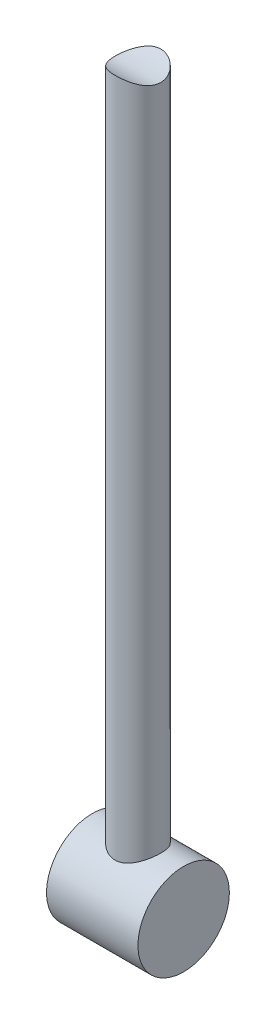
ISO-10303-21;
HEADER;
FILE_DESCRIPTION(('STEP AP214'),'2;1');
FILE_NAME('part.step','',(''),(''),'','','');
FILE_SCHEMA(('AUTOMOTIVE_DESIGN { 1 0 10303 214 1 1 1 1 }'));
ENDSEC;
DATA;
#1=APPLICATION_CONTEXT('core data for automotive mechanical design processes');
#2=APPLICATION_PROTOCOL_DEFINITION('international standard','automotive_design',2000,#1);
#3=PRODUCT_CONTEXT('',#1,'mechanical');
#4=PRODUCT('Part','Part','',(#3));
#5=PRODUCT_RELATED_PRODUCT_CATEGORY('part','',(#4));
#6=PRODUCT_DEFINITION_FORMATION('','',#4);
#7=PRODUCT_DEFINITION_CONTEXT('part definition',#1,'design');
#8=PRODUCT_DEFINITION('design','',#6,#7);
#9=PRODUCT_DEFINITION_SHAPE('','',#8);
#10=(LENGTH_UNIT() NAMED_UNIT(*) SI_UNIT(.MILLI.,.METRE.));
#11=(NAMED_UNIT(*) PLANE_ANGLE_UNIT() SI_UNIT($,.RADIAN.));
#12=(NAMED_UNIT(*) SI_UNIT($,.STERADIAN.) SOLID_ANGLE_UNIT());
#13=UNCERTAINTY_MEASURE_WITH_UNIT(LENGTH_MEASURE(1.E-05),#10,'distance_accuracy_value','');
#14=(GEOMETRIC_REPRESENTATION_CONTEXT(3) GLOBAL_UNCERTAINTY_ASSIGNED_CONTEXT((#13)) GLOBAL_UNIT_ASSIGNED_CONTEXT((#10,
#11,#12)) REPRESENTATION_CONTEXT('',''));
#15=CARTESIAN_POINT('',(0.,0.,0.));
#16=DIRECTION('',(0.,0.,1.));
#17=DIRECTION('',(1.,0.,0.));
#18=AXIS2_PLACEMENT_3D('',#15,#16,#17);
#19=CARTESIAN_POINT('',(50.,0.,0.));
#20=DIRECTION('',(-1.,0.,0.));
#21=DIRECTION('',(0.,0.,1.));
#22=AXIS2_PLACEMENT_3D('',#19,#20,#21);
#23=CYLINDRICAL_SURFACE('',#22,50.);
#24=CARTESIAN_POINT('',(50.,0.,0.));
#25=DIRECTION('',(1.,0.,0.));
#26=DIRECTION('',(0.,0.,-1.));
#27=AXIS2_PLACEMENT_3D('',#24,#25,#26);
#28=CIRCLE('',#27,50.);
#29=CARTESIAN_POINT('',(50.,0.,-50.));
#30=VERTEX_POINT('',#29);
#31=EDGE_CURVE('E44',#30,#30,#28,.T.);
#32=ORIENTED_EDGE('',*,*,#31,.F.);
#33=EDGE_LOOP('',(#32));
#34=FACE_BOUND('',#33,.T.);
#35=CARTESIAN_POINT('',(-50.,0.,0.));
#36=DIRECTION('',(1.,0.,0.));
#37=DIRECTION('',(0.,0.,-1.));
#38=AXIS2_PLACEMENT_3D('',#35,#36,#37);
#39=CIRCLE('',#38,50.);
#40=CARTESIAN_POINT('',(-50.,0.,-50.));
#41=VERTEX_POINT('',#40);
#42=EDGE_CURVE('E48',#41,#41,#39,.T.);
#43=ORIENTED_EDGE('',*,*,#42,.T.);
#44=EDGE_LOOP('',(#43));
#45=FACE_BOUND('',#44,.T.);
#46=CARTESIAN_POINT('',(0.,43.3012701892219,-25.));
#47=CARTESIAN_POINT('',(-0.651657728078345,43.3012738974014,-24.9999972492967));
#48=CARTESIAN_POINT('',(-1.30337199528604,43.3160310243838,-24.9744865840936));
#49=CARTESIAN_POINT('',(-2.60177863889863,43.3745117210766,-24.8727781222585));
#50=CARTESIAN_POINT('',(-3.24846853548874,43.4182487761207,-24.7965567281536));
#51=CARTESIAN_POINT('',(-4.53272868796324,43.5331573576325,-24.594261965626));
#52=CARTESIAN_POINT('',(-5.17027999705686,43.604379161414,-24.4680972258423));
#53=CARTESIAN_POINT('',(-6.43045471544741,43.7716876183493,-24.1675168252073));
#54=CARTESIAN_POINT('',(-7.0530795491345,43.8677718885472,-23.9931057884363));
#55=CARTESIAN_POINT('',(-8.2762885876815,44.0810172919438,-23.599020492088));
#56=CARTESIAN_POINT('',(-8.87697298138665,44.1980627806722,-23.3795936665704));
#57=CARTESIAN_POINT('',(-10.0565840143935,44.450003078188,-22.8969708071432));
#58=CARTESIAN_POINT('',(-10.6355102011031,44.584898258003,-22.6337738633895));
#59=CARTESIAN_POINT('',(-11.7687683585691,44.8687304990091,-22.0657597161742));
#60=CARTESIAN_POINT('',(-12.3231060045315,45.0176642949286,-21.7609521836511));
#61=CARTESIAN_POINT('',(-13.405222067322,45.3258294680467,-21.1115697238676));
#62=CARTESIAN_POINT('',(-13.9329906242587,45.4850646187509,-20.766980187319));
#63=CARTESIAN_POINT('',(-15.0020081204318,45.8233826320237,-20.0100786450758));
#64=CARTESIAN_POINT('',(-15.5407899017115,46.0030202537628,-19.5945268058562));
#65=CARTESIAN_POINT('',(-16.5821820892583,46.365184933611,-18.7214577237365));
#66=CARTESIAN_POINT('',(-17.0847906143755,46.5477121413885,-18.2639383011691));
#67=CARTESIAN_POINT('',(-18.0517317034124,46.9112371384387,-17.3088715339642));
#68=CARTESIAN_POINT('',(-18.5160391270901,47.0922338542696,-16.8112983153376));
#69=CARTESIAN_POINT('',(-19.403358645631,47.4481317438997,-15.778873095701));
#70=CARTESIAN_POINT('',(-19.8263845601862,47.6230349449123,-15.2440336736723));
#71=CARTESIAN_POINT('',(-20.6559103346768,47.9741176674734,-14.101935890209));
#72=CARTESIAN_POINT('',(-21.059348132888,48.1495806286941,-13.4922260925484));
#73=CARTESIAN_POINT('',(-21.8130164090103,48.4839520678333,-12.2363642027715));
#74=CARTESIAN_POINT('',(-22.1632438315922,48.6428595949776,-11.5902100209449));
#75=CARTESIAN_POINT('',(-22.8068723133523,48.9394715219822,-10.2658796175507));
#76=CARTESIAN_POINT('',(-23.1003009240628,49.0771861952305,-9.58771912093295));
#77=CARTESIAN_POINT('',(-23.6271574422266,49.3273633204677,-8.20398216536625));
#78=CARTESIAN_POINT('',(-23.8605917227733,49.4398284545107,-7.49840862763116));
#79=CARTESIAN_POINT('',(-24.2500719399282,49.6290152537626,-6.11654042575088));
#80=CARTESIAN_POINT('',(-24.410441753632,49.7077104710276,-5.44173347042513));
#81=CARTESIAN_POINT('',(-24.6748266692845,49.8380758594528,-4.07858290347345));
#82=CARTESIAN_POINT('',(-24.7788442214104,49.8897472055983,-3.3902398817399));
#83=CARTESIAN_POINT('',(-24.9290995504173,49.9645450119384,-2.00608536322839));
#84=CARTESIAN_POINT('',(-24.9753667718625,49.9876860185286,-1.31027785496801));
#85=CARTESIAN_POINT('',(-25.0095715600164,50.0047839981938,0.0831103975767554));
#86=CARTESIAN_POINT('',(-24.9975126954156,49.9987427567891,0.780691030762022));
#87=CARTESIAN_POINT('',(-24.9188401315975,49.9594597758389,2.11091341143743));
#88=CARTESIAN_POINT('',(-24.8570687182852,49.9286325703957,2.7439201254428));
#89=CARTESIAN_POINT('',(-24.6857933574407,49.8435839162395,4.00180573261866));
#90=CARTESIAN_POINT('',(-24.576292770444,49.7893641145649,4.62668519482671));
#91=CARTESIAN_POINT('',(-24.3107512890051,49.6588288150231,5.86411664160768));
#92=CARTESIAN_POINT('',(-24.1547088784611,49.5825125973665,6.47666822390543));
#93=CARTESIAN_POINT('',(-23.7976713405259,49.4095616746076,7.68557846708672));
#94=CARTESIAN_POINT('',(-23.5966745985519,49.3129262397264,8.28193654550033));
#95=CARTESIAN_POINT('',(-23.1485341467428,49.1000532579772,9.46307781020892));
#96=CARTESIAN_POINT('',(-22.9007934938713,48.9835642756784,10.0475888012673));
#97=CARTESIAN_POINT('',(-22.3631542092352,48.7345249487321,11.1932924970822));
#98=CARTESIAN_POINT('',(-22.073255627975,48.6019746233257,11.7544852297725));
#99=CARTESIAN_POINT('',(-21.4533967659483,48.3236126521289,12.8510127622086));
#100=CARTESIAN_POINT('',(-21.1234266116358,48.1777977402037,13.3863411434307));
#101=CARTESIAN_POINT('',(-20.4256190341222,47.8759538475335,14.4287052512528));
#102=CARTESIAN_POINT('',(-20.0577785424352,47.7199240394887,14.9357386800821));
#103=CARTESIAN_POINT('',(-19.2498172622248,47.3857329059286,15.9659829272969));
#104=CARTESIAN_POINT('',(-18.8061507663467,47.2068738780239,16.4861908868765));
#105=CARTESIAN_POINT('',(-17.878545130929,46.845063438937,17.4878151609516));
#106=CARTESIAN_POINT('',(-17.3946036999607,46.6621117953404,17.9692292652126));
#107=CARTESIAN_POINT('',(-16.3884818333071,46.2964642917558,18.8913612335406));
#108=CARTESIAN_POINT('',(-15.8662738391005,46.1137687146198,19.3320492409618));
#109=CARTESIAN_POINT('',(-15.0565544991401,45.843593954014,19.9603840123244));
#110=CARTESIAN_POINT('',(-14.7822362181157,45.7541772399156,20.1643863204588));
#111=CARTESIAN_POINT('',(-14.2249760149928,45.5771884650086,20.5613013775411));
#112=CARTESIAN_POINT('',(-13.942031409767,45.489616992766,20.7542106211332));
#113=CARTESIAN_POINT('',(-13.0443742119748,45.2196491270857,21.3395295271279));
#114=CARTESIAN_POINT('',(-12.415048704098,45.0415831062525,21.7118230929146));
#115=CARTESIAN_POINT('',(-11.1225584877746,44.7026030694781,22.401452093898));
#116=CARTESIAN_POINT('',(-10.4593967999659,44.5416875264198,22.7187924238286));
#117=CARTESIAN_POINT('',(-9.44266825702121,44.3176563216602,23.1510609956445));
#118=CARTESIAN_POINT('',(-9.1001600119892,44.2458813176476,23.2878388705815));
#119=CARTESIAN_POINT('',(-8.40838786333443,44.1087973854835,23.5464514655133));
#120=CARTESIAN_POINT('',(-8.05912571077178,44.043486807495,23.6682900002));
#121=CARTESIAN_POINT('',(-7.00201342033252,43.8582674733307,24.0108330854159));
#122=CARTESIAN_POINT('',(-6.28464457283938,43.749027978065,24.2086472902985));
#123=CARTESIAN_POINT('',(-4.88870901344563,43.5713053774777,24.5269620029075));
#124=CARTESIAN_POINT('',(-4.21156873362961,43.5002796598521,24.6523447935619));
#125=CARTESIAN_POINT('',(-2.84669344068969,43.3894151546965,24.8469575763003));
#126=CARTESIAN_POINT('',(-2.15895902852085,43.3495746047734,24.916190741622));
#127=CARTESIAN_POINT('',(-0.779421212571224,43.3028003096564,24.9973937987513));
#128=CARTESIAN_POINT('',(-0.0876205201857683,43.2958466843241,25.0093982853171));
#129=CARTESIAN_POINT('',(1.29410670579054,43.3150972499871,24.9760435062342));
#130=CARTESIAN_POINT('',(1.98403336273574,43.3412992028496,24.9306881126047));
#131=CARTESIAN_POINT('',(3.2805525639814,43.4210793380396,24.7914377927162));
#132=CARTESIAN_POINT('',(3.88799241923915,43.4713430273842,24.7034064080223));
#133=CARTESIAN_POINT('',(5.09235719600756,43.5955661816634,24.4835158457237));
#134=CARTESIAN_POINT('',(5.6892830434807,43.66952354879,24.3516605481936));
#135=CARTESIAN_POINT('',(6.86915997755549,43.8388445712505,24.0455037172597));
#136=CARTESIAN_POINT('',(7.45210761033612,43.9342134579594,23.8711918097489));
#137=CARTESIAN_POINT('',(8.6007779677829,44.1435654387753,23.4817897713769));
#138=CARTESIAN_POINT('',(9.16649963911454,44.2575496684739,23.2666971526418));
#139=CARTESIAN_POINT('',(10.3036310513174,44.5066624984352,22.7866934178469));
#140=CARTESIAN_POINT('',(10.8741040265233,44.6425228592292,22.5199449130061));
#141=CARTESIAN_POINT('',(11.9909294700445,44.9276158962726,21.9456625079577));
#142=CARTESIAN_POINT('',(12.5372714883265,45.0768542828119,21.6381111642824));
#143=CARTESIAN_POINT('',(13.6034940304572,45.3849587766745,20.9841879069052));
#144=CARTESIAN_POINT('',(14.1233692262792,45.5438268085479,20.6378082212681));
#145=CARTESIAN_POINT('',(15.1345879150036,45.8674857084529,19.9081156666699));
#146=CARTESIAN_POINT('',(15.625929372136,46.0322769977309,19.5248001676595));
#147=CARTESIAN_POINT('',(16.6383010122431,46.3851314469512,18.6723933753344));
#148=CARTESIAN_POINT('',(17.1552571745104,46.573507868278,18.1985814957771));
#149=CARTESIAN_POINT('',(18.1479612677743,46.9482395083491,17.208801457832));
#150=CARTESIAN_POINT('',(18.6237060214299,47.1345945702822,16.6928300549538));
#151=CARTESIAN_POINT('',(19.5313825427206,47.500551032776,15.6210867099589));
#152=CARTESIAN_POINT('',(19.9632988201806,47.6801500315453,15.0653008138923));
#153=CARTESIAN_POINT('',(20.78021650138,48.0279167170745,13.9168654136766));
#154=CARTESIAN_POINT('',(21.1652183667226,48.1960845163019,13.3242162723211));
#155=CARTESIAN_POINT('',(21.8948385164209,48.5208655173557,12.0890056860871));
#156=CARTESIAN_POINT('',(22.2381140666933,48.6770536851778,11.445537083859));
#157=CARTESIAN_POINT('',(22.8686774667118,48.9683386405048,10.1270695634352));
#158=CARTESIAN_POINT('',(23.1559634400449,49.1034347211076,9.45206958944888));
#159=CARTESIAN_POINT('',(23.6710809469709,49.3484422850348,8.07584855033878));
#160=CARTESIAN_POINT('',(23.8989549518689,49.4583717521001,7.37464662821721));
#161=CARTESIAN_POINT('',(24.2925476674675,49.6497556882262,5.95123328017071));
#162=CARTESIAN_POINT('',(24.458273748637,49.7312135338176,5.22902435653721));
#163=CARTESIAN_POINT('',(24.7129738270469,49.8569959046632,3.83701251064259));
#164=CARTESIAN_POINT('',(24.8075966684247,49.9040426202125,3.16848428122956));
#165=CARTESIAN_POINT('',(24.9424667472851,49.9712236366136,1.82462999197066));
#166=CARTESIAN_POINT('',(24.9827174357542,49.9913596454803,1.14930436629497));
#167=CARTESIAN_POINT('',(25.0083162364952,50.0041574921416,-0.20243985490905));
#168=CARTESIAN_POINT('',(24.9936807058504,49.996827515296,-0.878858064769197));
#169=CARTESIAN_POINT('',(24.9097358222379,49.954915747023,-2.22742891911758));
#170=CARTESIAN_POINT('',(24.8404279743976,49.9203347058167,-2.89958168051999));
#171=CARTESIAN_POINT('',(24.6543998024786,49.8280383988319,-4.19012849545484));
#172=CARTESIAN_POINT('',(24.5411116057829,49.7720011161012,-4.80914210853196));
#173=CARTESIAN_POINT('',(24.2688562352993,49.638325111347,-6.03461366863557));
#174=CARTESIAN_POINT('',(24.109891640303,49.5606876088334,-6.64107232241653));
#175=CARTESIAN_POINT('',(23.747849994662,49.3855777801893,-7.83775931737802));
#176=CARTESIAN_POINT('',(23.5447695147136,49.2881039121362,-8.42798639279268));
#177=CARTESIAN_POINT('',(23.0963397362171,49.0754720301766,-9.5888648262004));
#178=CARTESIAN_POINT('',(22.8509884649227,48.9603131909529,-10.1595152690755));
#179=CARTESIAN_POINT('',(22.308659364884,48.7095065616211,-11.3022392748832));
#180=CARTESIAN_POINT('',(22.0099237661831,48.5731936311758,-11.8733321215653));
#181=CARTESIAN_POINT('',(21.3709751726378,48.2870272685357,-12.9882367601858));
#182=CARTESIAN_POINT('',(21.030761401556,48.1371735829479,-13.5320480412983));
#183=CARTESIAN_POINT('',(20.3110145040853,47.82710328795,-14.5901418631954));
#184=CARTESIAN_POINT('',(19.9314678829649,47.6668831290299,-15.1044141747537));
#185=CARTESIAN_POINT('',(19.135326866118,47.3395085084327,-16.1011229628171));
#186=CARTESIAN_POINT('',(18.7187291259197,47.1723534214926,-16.5835565584941));
#187=CARTESIAN_POINT('',(17.8073460558901,46.8178193567662,-17.5609868614201));
#188=CARTESIAN_POINT('',(17.3089057811131,46.630083800416,-18.0524521311881));
#189=CARTESIAN_POINT('',(16.2724114852239,46.2553556901095,-18.9920498989603));
#190=CARTESIAN_POINT('',(15.7343545615364,46.0683631916543,-19.4401792163128));
#191=CARTESIAN_POINT('',(14.6207785923102,45.7000088573962,-20.2909910624585));
#192=CARTESIAN_POINT('',(14.0452252134736,45.5186524130988,-20.6936309903305));
#193=CARTESIAN_POINT('',(12.859787725171,45.1669568158024,-21.4504110417563));
#194=CARTESIAN_POINT('',(12.2499062502337,44.9966168194902,-21.8045548800276));
#195=CARTESIAN_POINT('',(11.3018607185228,44.7508086460529,-22.3024856266454));
#196=CARTESIAN_POINT('',(10.9750333120999,44.6693211671637,-22.4651334968817));
#197=CARTESIAN_POINT('',(10.3136429723918,44.5114376206162,-22.7763547859923));
#198=CARTESIAN_POINT('',(9.97908184493879,44.4350403802383,-22.9249314500231));
#199=CARTESIAN_POINT('',(8.96426144522224,44.2145039056118,-23.3490772961765));
#200=CARTESIAN_POINT('',(8.2728835951333,44.0790247669708,-23.6030526309905));
#201=CARTESIAN_POINT('',(6.86794293612769,43.8370978970742,-24.0493909122374));
#202=CARTESIAN_POINT('',(6.15445136020553,43.7305659487763,-24.2419328799137));
#203=CARTESIAN_POINT('',(4.70954394909072,43.5507401419656,-24.5635340961408));
#204=CARTESIAN_POINT('',(3.97814102285206,43.4774230473757,-24.6926377295426));
#205=CARTESIAN_POINT('',(2.705009829799,43.3823768905292,-24.8591156657607));
#206=CARTESIAN_POINT('',(2.16587885060812,43.3520358806036,-24.91189663269));
#207=CARTESIAN_POINT('',(1.08451176835219,43.3114803138654,-24.9823411189456));
#208=CARTESIAN_POINT('',(0.542275459994326,43.301267103469,-25.0000022889913));
#209=CARTESIAN_POINT('',(0.,43.3012701892219,-25.));
#210=B_SPLINE_CURVE_WITH_KNOTS('',3,(#46,#47,#48,#49,#50,#51,#52,#53,#54,#55,#56,#57,#58,#59,
#60,#61,#62,#63,#64,#65,#66,#67,#68,#69,#70,#71,#72,#73,#74,#75,#76,#77,#78,#79,#80,#81,#82,#83,
#84,#85,#86,#87,#88,#89,#90,#91,#92,#93,#94,#95,#96,#97,#98,#99,#100,#101,#102,#103,#104,#105,
#106,#107,#108,#109,#110,#111,#112,#113,#114,#115,#116,#117,#118,#119,#120,#121,#122,#123,#124,
#125,#126,#127,#128,#129,#130,#131,#132,#133,#134,#135,#136,#137,#138,#139,#140,#141,#142,#143,
#144,#145,#146,#147,#148,#149,#150,#151,#152,#153,#154,#155,#156,#157,#158,#159,#160,#161,#162,
#163,#164,#165,#166,#167,#168,#169,#170,#171,#172,#173,#174,#175,#176,#177,#178,#179,#180,#181,
#182,#183,#184,#185,#186,#187,#188,#189,#190,#191,#192,#193,#194,#195,#196,#197,#198,#199,#200,
#201,#202,#203,#204,#205,#206,#207,#208,#209),.UNSPECIFIED.,.T.,.F.,(4,2,2,2,2,2,2,2,2,2,2,2,2,
2,2,2,2,2,2,2,2,2,2,2,2,2,2,2,2,2,2,2,2,2,2,2,2,2,2,2,2,2,2,2,2,2,2,2,2,2,2,2,2,2,2,2,2,2,2,2,2,
2,2,2,2,2,2,2,2,2,2,2,2,2,2,2,2,2,2,2,2,4),(0.,1.95441192278272,3.90973393836879,
5.86864987236744,7.8273781225633,9.7756153845597,11.723893149394,13.6717188730885,
15.620262192923,17.7292201070748,19.8382876161037,21.9487286473746,24.0584607311283,
26.3111473362998,28.5639632414418,30.8156836143288,33.067164691916,35.1584826548101,
37.2497096806103,39.339870037992,41.4299025102115,43.3379272290007,45.2458176284876,
47.153770184371,49.0617912774175,50.9960675392925,52.9303414839626,54.8650930001226,
56.8000014052271,58.917848189163,61.0358155497571,63.1553234931732,64.2151556831173,
65.2753209551759,67.5299925667647,69.7844632493247,70.9112804180446,72.0378092573376,
74.2902273803598,76.3642610710997,78.4381775418091,80.5108401701136,82.5833628929462,
84.4287799170669,86.2740335954545,88.1197386074929,89.9655562551281,91.8963352398348,
93.8279423204728,95.7599367269954,97.6920688048029,99.8679420645494,102.043982932003,
104.220790212283,106.39757607266,108.632125578475,110.866749959239,113.099772486652,
115.332530103652,117.360339064742,119.388019315274,121.415095328543,123.442115538416,
125.335316614567,127.228410825634,129.121652247157,131.014982048795,132.989197931268,
134.9634507656,136.938383204219,138.913494094206,141.085252835438,143.257170852589,
145.431106304714,147.604875143848,148.726679825932,149.848225159809,152.091379766987,
154.327936660809,156.562926503801,158.1891770497,159.815536377274),.UNSPECIFIED.);
#211=CARTESIAN_POINT('',(0.,43.3012701892219,-25.));
#212=VERTEX_POINT('',#211);
#213=EDGE_CURVE('E10',#212,#212,#210,.T.);
#214=ORIENTED_EDGE('',*,*,#213,.F.);
#215=EDGE_LOOP('',(#214));
#216=FACE_BOUND('',#215,.T.);
#217=ADVANCED_FACE('F31',(#34,#45,#216),#23,.T.);
#218=CARTESIAN_POINT('',(50.,0.,0.));
#219=DIRECTION('',(1.,0.,0.));
#220=DIRECTION('',(0.,0.,-1.));
#221=AXIS2_PLACEMENT_3D('',#218,#219,#220);
#222=PLANE('',#221);
#223=ORIENTED_EDGE('',*,*,#31,.T.);
#224=EDGE_LOOP('',(#223));
#225=FACE_BOUND('',#224,.T.);
#226=ADVANCED_FACE('F62',(#225),#222,.T.);
#227=CARTESIAN_POINT('',(-50.,0.,0.));
#228=DIRECTION('',(1.,0.,0.));
#229=DIRECTION('',(0.,0.,-1.));
#230=AXIS2_PLACEMENT_3D('',#227,#228,#229);
#231=PLANE('',#230);
#232=ORIENTED_EDGE('',*,*,#42,.F.);
#233=EDGE_LOOP('',(#232));
#234=FACE_BOUND('',#233,.T.);
#235=ADVANCED_FACE('F59',(#234),#231,.F.);
#236=CARTESIAN_POINT('',(0.,800.,0.));
#237=DIRECTION('',(0.,-1.,0.));
#238=DIRECTION('',(0.,0.,-1.));
#239=AXIS2_PLACEMENT_3D('',#236,#237,#238);
#240=CYLINDRICAL_SURFACE('',#239,25.);
#241=CARTESIAN_POINT('',(0.,786.698729810778,-25.));
#242=CARTESIAN_POINT('',(0.651657728078345,786.698726102599,-24.9999972492967));
#243=CARTESIAN_POINT('',(1.30337199528604,786.683968975616,-24.9744865840936));
#244=CARTESIAN_POINT('',(2.60177863889862,786.625488278923,-24.8727781222585));
#245=CARTESIAN_POINT('',(3.24846853548874,786.581751223879,-24.7965567281536));
#246=CARTESIAN_POINT('',(4.53272868796324,786.466842642367,-24.594261965626));
#247=CARTESIAN_POINT('',(5.17027999705686,786.395620838586,-24.4680972258423));
#248=CARTESIAN_POINT('',(6.43045471544741,786.228312381651,-24.1675168252073));
#249=CARTESIAN_POINT('',(7.0530795491345,786.132228111453,-23.9931057884363));
#250=CARTESIAN_POINT('',(8.27628858768151,785.918982708056,-23.599020492088));
#251=CARTESIAN_POINT('',(8.87697298138667,785.801937219328,-23.3795936665704));
#252=CARTESIAN_POINT('',(10.0565840143935,785.549996921812,-22.8969708071432));
#253=CARTESIAN_POINT('',(10.6355102011032,785.415101741997,-22.6337738633895));
#254=CARTESIAN_POINT('',(11.7687683585691,785.131269500991,-22.0657597161741));
#255=CARTESIAN_POINT('',(12.3231060045316,784.982335705071,-21.7609521836511));
#256=CARTESIAN_POINT('',(13.405222067322,784.674170531953,-21.1115697238676));
#257=CARTESIAN_POINT('',(13.9329906242587,784.514935381249,-20.766980187319));
#258=CARTESIAN_POINT('',(15.0020081204318,784.176617367976,-20.0100786450758));
#259=CARTESIAN_POINT('',(15.5407899017115,783.996979746237,-19.5945268058562));
#260=CARTESIAN_POINT('',(16.5821820892583,783.634815066389,-18.7214577237365));
#261=CARTESIAN_POINT('',(17.0847906143755,783.452287858611,-18.2639383011691));
#262=CARTESIAN_POINT('',(18.0517317034124,783.088762861561,-17.3088715339642));
#263=CARTESIAN_POINT('',(18.5160391270901,782.90776614573,-16.8112983153376));
#264=CARTESIAN_POINT('',(19.403358645631,782.5518682561,-15.778873095701));
#265=CARTESIAN_POINT('',(19.8263845601862,782.376965055088,-15.2440336736723));
#266=CARTESIAN_POINT('',(20.6559103346768,782.025882332527,-14.101935890209));
#267=CARTESIAN_POINT('',(21.059348132888,781.850419371306,-13.4922260925484));
#268=CARTESIAN_POINT('',(21.8130164090103,781.516047932167,-12.2363642027715));
#269=CARTESIAN_POINT('',(22.1632438315922,781.357140405023,-11.5902100209449));
#270=CARTESIAN_POINT('',(22.8068723133523,781.060528478018,-10.2658796175507));
#271=CARTESIAN_POINT('',(23.1003009240628,780.92281380477,-9.58771912093294));
#272=CARTESIAN_POINT('',(23.6271574422266,780.672636679532,-8.20398216536624));
#273=CARTESIAN_POINT('',(23.8605917227733,780.560171545489,-7.49840862763116));
#274=CARTESIAN_POINT('',(24.2500719399282,780.370984746237,-6.11654042575088));
#275=CARTESIAN_POINT('',(24.410441753632,780.292289528972,-5.44173347042512));
#276=CARTESIAN_POINT('',(24.6748266692845,780.161924140547,-4.07858290347344));
#277=CARTESIAN_POINT('',(24.7788442214104,780.110252794402,-3.39023988173989));
#278=CARTESIAN_POINT('',(24.9290995504173,780.035454988062,-2.00608536322838));
#279=CARTESIAN_POINT('',(24.9753667718625,780.012313981471,-1.310277854968));
#280=CARTESIAN_POINT('',(25.0095715600164,779.995216001806,0.0831103975767684));
#281=CARTESIAN_POINT('',(24.9975126954156,780.001257243211,0.780691030762034));
#282=CARTESIAN_POINT('',(24.9188401315975,780.040540224161,2.11091341143745));
#283=CARTESIAN_POINT('',(24.8570687182852,780.071367429604,2.74392012544282));
#284=CARTESIAN_POINT('',(24.6857933574407,780.15641608376,4.00180573261869));
#285=CARTESIAN_POINT('',(24.576292770444,780.210635885435,4.62668519482673));
#286=CARTESIAN_POINT('',(24.3107512890051,780.341171184977,5.8641166416077));
#287=CARTESIAN_POINT('',(24.1547088784611,780.417487402633,6.47666822390544));
#288=CARTESIAN_POINT('',(23.7976713405259,780.590438325392,7.68557846708672));
#289=CARTESIAN_POINT('',(23.5966745985519,780.687073760274,8.28193654550033));
#290=CARTESIAN_POINT('',(23.1485341467428,780.899946742023,9.46307781020892));
#291=CARTESIAN_POINT('',(22.9007934938713,781.016435724322,10.0475888012673));
#292=CARTESIAN_POINT('',(22.3631542092352,781.265475051268,11.1932924970822));
#293=CARTESIAN_POINT('',(22.073255627975,781.398025376674,11.7544852297725));
#294=CARTESIAN_POINT('',(21.4533967659483,781.676387347871,12.8510127622086));
#295=CARTESIAN_POINT('',(21.1234266116358,781.822202259796,13.3863411434307));
#296=CARTESIAN_POINT('',(20.4256190341222,782.124046152466,14.4287052512528));
#297=CARTESIAN_POINT('',(20.0577785424352,782.280075960511,14.9357386800821));
#298=CARTESIAN_POINT('',(19.2498172622248,782.614267094071,15.9659829272969));
#299=CARTESIAN_POINT('',(18.8061507663467,782.793126121976,16.4861908868765));
#300=CARTESIAN_POINT('',(17.878545130929,783.154936561063,17.4878151609516));
#301=CARTESIAN_POINT('',(17.3946036999607,783.33788820466,17.9692292652126));
#302=CARTESIAN_POINT('',(16.3884818333071,783.703535708244,18.8913612335407));
#303=CARTESIAN_POINT('',(15.8662738391005,783.88623128538,19.3320492409618));
#304=CARTESIAN_POINT('',(15.0565544991401,784.156406045986,19.9603840123244));
#305=CARTESIAN_POINT('',(14.7822362181157,784.245822760084,20.1643863204588));
#306=CARTESIAN_POINT('',(14.2249760149928,784.422811534991,20.5613013775411));
#307=CARTESIAN_POINT('',(13.942031409767,784.510383007234,20.7542106211332));
#308=CARTESIAN_POINT('',(13.0443742119748,784.780350872914,21.339529527128));
#309=CARTESIAN_POINT('',(12.415048704098,784.958416893747,21.7118230929146));
#310=CARTESIAN_POINT('',(11.1225584877746,785.297396930522,22.401452093898));
#311=CARTESIAN_POINT('',(10.4593967999659,785.45831247358,22.7187924238286));
#312=CARTESIAN_POINT('',(9.44266825702119,785.68234367834,23.1510609956445));
#313=CARTESIAN_POINT('',(9.10016001198919,785.754118682352,23.2878388705815));
#314=CARTESIAN_POINT('',(8.40838786333441,785.891202614516,23.5464514655133));
#315=CARTESIAN_POINT('',(8.05912571077176,785.956513192505,23.6682900002));
#316=CARTESIAN_POINT('',(7.0020134203325,786.141732526669,24.0108330854159));
#317=CARTESIAN_POINT('',(6.28464457283938,786.250972021935,24.2086472902985));
#318=CARTESIAN_POINT('',(4.88870901344563,786.428694622522,24.5269620029075));
#319=CARTESIAN_POINT('',(4.21156873362959,786.499720340148,24.652344793562));
#320=CARTESIAN_POINT('',(2.84669344068967,786.610584845304,24.8469575763003));
#321=CARTESIAN_POINT('',(2.15895902852084,786.650425395227,24.916190741622));
#322=CARTESIAN_POINT('',(0.779421212571208,786.697199690344,24.9973937987513));
#323=CARTESIAN_POINT('',(0.0876205201857505,786.704153315676,25.0093982853171));
#324=CARTESIAN_POINT('',(-1.29410670579056,786.684902750013,24.9760435062342));
#325=CARTESIAN_POINT('',(-1.98403336273575,786.65870079715,24.9306881126047));
#326=CARTESIAN_POINT('',(-3.2805525639814,786.57892066196,24.7914377927162));
#327=CARTESIAN_POINT('',(-3.88799241923916,786.528656972616,24.7034064080223));
#328=CARTESIAN_POINT('',(-5.09235719600757,786.404433818337,24.4835158457237));
#329=CARTESIAN_POINT('',(-5.68928304348071,786.33047645121,24.3516605481936));
#330=CARTESIAN_POINT('',(-6.8691599775555,786.16115542875,24.0455037172596));
#331=CARTESIAN_POINT('',(-7.45210761033613,786.065786542041,23.8711918097489));
#332=CARTESIAN_POINT('',(-8.60077796778291,785.856434561225,23.4817897713769));
#333=CARTESIAN_POINT('',(-9.16649963911455,785.742450331526,23.2666971526418));
#334=CARTESIAN_POINT('',(-10.3036310513174,785.493337501565,22.7866934178468));
#335=CARTESIAN_POINT('',(-10.8741040265233,785.357477140771,22.5199449130062));
#336=CARTESIAN_POINT('',(-11.9909294700445,785.072384103727,21.9456625079577));
#337=CARTESIAN_POINT('',(-12.5372714883265,784.923145717188,21.6381111642824));
#338=CARTESIAN_POINT('',(-13.6034940304572,784.615041223326,20.9841879069052));
#339=CARTESIAN_POINT('',(-14.1233692262792,784.456173191452,20.6378082212681));
#340=CARTESIAN_POINT('',(-15.1345879150036,784.132514291547,19.9081156666699));
#341=CARTESIAN_POINT('',(-15.625929372136,783.967723002269,19.5248001676595));
#342=CARTESIAN_POINT('',(-16.6383010122431,783.614868553049,18.6723933753344));
#343=CARTESIAN_POINT('',(-17.1552571745104,783.426492131722,18.1985814957771));
#344=CARTESIAN_POINT('',(-18.1479612677744,783.051760491651,17.208801457832));
#345=CARTESIAN_POINT('',(-18.6237060214299,782.865405429718,16.6928300549538));
#346=CARTESIAN_POINT('',(-19.5313825427206,782.499448967224,15.6210867099589));
#347=CARTESIAN_POINT('',(-19.9632988201806,782.319849968455,15.0653008138923));
#348=CARTESIAN_POINT('',(-20.78021650138,781.972083282926,13.9168654136765));
#349=CARTESIAN_POINT('',(-21.1652183667226,781.803915483698,13.324216272321));
#350=CARTESIAN_POINT('',(-21.8948385164209,781.479134482644,12.0890056860871));
#351=CARTESIAN_POINT('',(-22.2381140666933,781.322946314822,11.445537083859));
#352=CARTESIAN_POINT('',(-22.8686774667118,781.031661359495,10.1270695634352));
#353=CARTESIAN_POINT('',(-23.1559634400449,780.896565278892,9.45206958944886));
#354=CARTESIAN_POINT('',(-23.6710809469709,780.651557714965,8.07584855033876));
#355=CARTESIAN_POINT('',(-23.8989549518689,780.5416282479,7.37464662821719));
#356=CARTESIAN_POINT('',(-24.2925476674675,780.350244311774,5.95123328017069));
#357=CARTESIAN_POINT('',(-24.458273748637,780.268786466183,5.22902435653718));
#358=CARTESIAN_POINT('',(-24.7129738270469,780.143004095337,3.83701251064255));
#359=CARTESIAN_POINT('',(-24.8075966684247,780.095957379788,3.16848428122952));
#360=CARTESIAN_POINT('',(-24.9424667472851,780.028776363386,1.82462999197063));
#361=CARTESIAN_POINT('',(-24.9827174357542,780.00864035452,1.14930436629494));
#362=CARTESIAN_POINT('',(-25.0083162364952,779.995842507858,-0.202439854909081));
#363=CARTESIAN_POINT('',(-24.9936807058504,780.003172484704,-0.878858064769226));
#364=CARTESIAN_POINT('',(-24.9097358222379,780.045084252977,-2.22742891911761));
#365=CARTESIAN_POINT('',(-24.8404279743976,780.079665294184,-2.89958168052002));
#366=CARTESIAN_POINT('',(-24.6543998024786,780.171961601168,-4.19012849545487));
#367=CARTESIAN_POINT('',(-24.5411116057829,780.227998883899,-4.80914210853199));
#368=CARTESIAN_POINT('',(-24.2688562352993,780.361674888653,-6.0346136686356));
#369=CARTESIAN_POINT('',(-24.109891640303,780.439312391167,-6.64107232241655));
#370=CARTESIAN_POINT('',(-23.747849994662,780.614422219811,-7.83775931737805));
#371=CARTESIAN_POINT('',(-23.5447695147136,780.711896087864,-8.42798639279272));
#372=CARTESIAN_POINT('',(-23.0963397362171,780.924527969823,-9.58886482620043));
#373=CARTESIAN_POINT('',(-22.8509884649227,781.039686809047,-10.1595152690755));
#374=CARTESIAN_POINT('',(-22.308659364884,781.290493438379,-11.3022392748832));
#375=CARTESIAN_POINT('',(-22.0099237661831,781.426806368824,-11.8733321215653));
#376=CARTESIAN_POINT('',(-21.3709751726378,781.712972731464,-12.9882367601859));
#377=CARTESIAN_POINT('',(-21.0307614015559,781.862826417052,-13.5320480412983));
#378=CARTESIAN_POINT('',(-20.3110145040852,782.17289671205,-14.5901418631954));
#379=CARTESIAN_POINT('',(-19.9314678829648,782.33311687097,-15.1044141747537));
#380=CARTESIAN_POINT('',(-19.135326866118,782.660491491567,-16.1011229628171));
#381=CARTESIAN_POINT('',(-18.7187291259197,782.827646578507,-16.5835565584942));
#382=CARTESIAN_POINT('',(-17.8073460558901,783.182180643234,-17.5609868614201));
#383=CARTESIAN_POINT('',(-17.3089057811131,783.369916199584,-18.0524521311882));
#384=CARTESIAN_POINT('',(-16.2724114852239,783.744644309891,-18.9920498989603));
#385=CARTESIAN_POINT('',(-15.7343545615363,783.931636808346,-19.4401792163128));
#386=CARTESIAN_POINT('',(-14.6207785923102,784.299991142604,-20.2909910624585));
#387=CARTESIAN_POINT('',(-14.0452252134735,784.481347586901,-20.6936309903305));
#388=CARTESIAN_POINT('',(-12.859787725171,784.833043184198,-21.4504110417564));
#389=CARTESIAN_POINT('',(-12.2499062502336,785.00338318051,-21.8045548800276));
#390=CARTESIAN_POINT('',(-11.3018607185228,785.249191353947,-22.3024856266454));
#391=CARTESIAN_POINT('',(-10.9750333120999,785.330678832836,-22.4651334968817));
#392=CARTESIAN_POINT('',(-10.3136429723918,785.488562379384,-22.7763547859923));
#393=CARTESIAN_POINT('',(-9.97908184493878,785.564959619762,-22.9249314500231));
#394=CARTESIAN_POINT('',(-8.96426144522223,785.785496094388,-23.3490772961765));
#395=CARTESIAN_POINT('',(-8.27288359513329,785.920975233029,-23.6030526309905));
#396=CARTESIAN_POINT('',(-6.86794293612768,786.162902102926,-24.0493909122374));
#397=CARTESIAN_POINT('',(-6.15445136020553,786.269434051224,-24.2419328799137));
#398=CARTESIAN_POINT('',(-4.70954394909072,786.449259858034,-24.5635340961408));
#399=CARTESIAN_POINT('',(-3.97814102285205,786.522576952624,-24.6926377295426));
#400=CARTESIAN_POINT('',(-2.70500982979899,786.617623109471,-24.8591156657607));
#401=CARTESIAN_POINT('',(-2.16587885060811,786.647964119396,-24.91189663269));
#402=CARTESIAN_POINT('',(-1.0845117683522,786.688519686135,-24.9823411189456));
#403=CARTESIAN_POINT('',(-0.542275459994327,786.698732896531,-25.0000022889913));
#404=CARTESIAN_POINT('',(0.,786.698729810778,-25.));
#405=B_SPLINE_CURVE_WITH_KNOTS('',3,(#241,#242,#243,#244,#245,#246,#247,#248,#249,#250,#251,
#252,#253,#254,#255,#256,#257,#258,#259,#260,#261,#262,#263,#264,#265,#266,#267,#268,#269,#270,
#271,#272,#273,#274,#275,#276,#277,#278,#279,#280,#281,#282,#283,#284,#285,#286,#287,#288,#289,
#290,#291,#292,#293,#294,#295,#296,#297,#298,#299,#300,#301,#302,#303,#304,#305,#306,#307,#308,
#309,#310,#311,#312,#313,#314,#315,#316,#317,#318,#319,#320,#321,#322,#323,#324,#325,#326,#327,
#328,#329,#330,#331,#332,#333,#334,#335,#336,#337,#338,#339,#340,#341,#342,#343,#344,#345,#346,
#347,#348,#349,#350,#351,#352,#353,#354,#355,#356,#357,#358,#359,#360,#361,#362,#363,#364,#365,
#366,#367,#368,#369,#370,#371,#372,#373,#374,#375,#376,#377,#378,#379,#380,#381,#382,#383,#384,
#385,#386,#387,#388,#389,#390,#391,#392,#393,#394,#395,#396,#397,#398,#399,#400,#401,#402,#403,
#404),.UNSPECIFIED.,.T.,.F.,(4,2,2,2,2,2,2,2,2,2,2,2,2,2,2,2,2,2,2,2,2,2,2,2,2,2,2,2,2,2,2,2,2,
2,2,2,2,2,2,2,2,2,2,2,2,2,2,2,2,2,2,2,2,2,2,2,2,2,2,2,2,2,2,2,2,2,2,2,2,2,2,2,2,2,2,2,2,2,2,2,2,
4),(0.,1.95441192278272,3.90973393836879,5.86864987236743,7.8273781225633,9.77561538455972,
11.723893149394,13.6717188730885,15.620262192923,17.7292201070748,19.8382876161037,
21.9487286473746,24.0584607311284,26.3111473362998,28.5639632414418,30.8156836143288,
33.067164691916,35.1584826548101,37.2497096806103,39.339870037992,41.4299025102115,
43.3379272290007,45.2458176284876,47.153770184371,49.0617912774175,50.9960675392925,
52.9303414839626,54.8650930001225,56.8000014052271,58.917848189163,61.0358155497571,
63.1553234931732,64.2151556831173,65.2753209551759,67.5299925667647,69.7844632493247,
70.9112804180447,72.0378092573376,74.2902273803598,76.3642610710997,78.4381775418091,
80.5108401701136,82.5833628929462,84.4287799170669,86.2740335954544,88.1197386074929,
89.9655562551281,91.8963352398348,93.8279423204728,95.7599367269954,97.6920688048029,
99.8679420645494,102.043982932003,104.220790212283,106.39757607266,108.632125578475,
110.866749959239,113.099772486652,115.332530103652,117.360339064742,119.388019315274,
121.415095328543,123.442115538416,125.335316614567,127.228410825634,129.121652247157,
131.014982048795,132.989197931268,134.9634507656,136.938383204219,138.913494094206,
141.085252835438,143.257170852589,145.431106304714,147.604875143848,148.726679825932,
149.848225159809,152.091379766987,154.327936660809,156.562926503801,158.1891770497,
159.815536377274),.UNSPECIFIED.);
#406=CARTESIAN_POINT('',(0.,786.698729810778,-25.));
#407=VERTEX_POINT('',#406);
#408=EDGE_CURVE('E35',#407,#407,#405,.T.);
#409=ORIENTED_EDGE('',*,*,#408,.T.);
#410=EDGE_LOOP('',(#409));
#411=FACE_BOUND('',#410,.T.);
#412=ORIENTED_EDGE('',*,*,#213,.T.);
#413=EDGE_LOOP('',(#412));
#414=FACE_BOUND('',#413,.T.);
#415=ADVANCED_FACE('F54',(#411,#414),#240,.T.);
#416=CARTESIAN_POINT('',(-50.,830.,0.));
#417=DIRECTION('',(1.,0.,0.));
#418=DIRECTION('',(0.,0.,-1.));
#419=AXIS2_PLACEMENT_3D('',#416,#417,#418);
#420=CYLINDRICAL_SURFACE('',#419,50.);
#421=ORIENTED_EDGE('',*,*,#408,.F.);
#422=EDGE_LOOP('',(#421));
#423=FACE_BOUND('',#422,.T.);
#424=ADVANCED_FACE('F58',(#423),#420,.F.);
#425=CLOSED_SHELL('',(#217,#226,#235,#415,#424));
#426=MANIFOLD_SOLID_BREP('B2',#425);
#427=ADVANCED_BREP_SHAPE_REPRESENTATION('',(#18,#426),#14);
#428=SHAPE_DEFINITION_REPRESENTATION(#9,#427);
ENDSEC;
END-ISO-10303-21;
